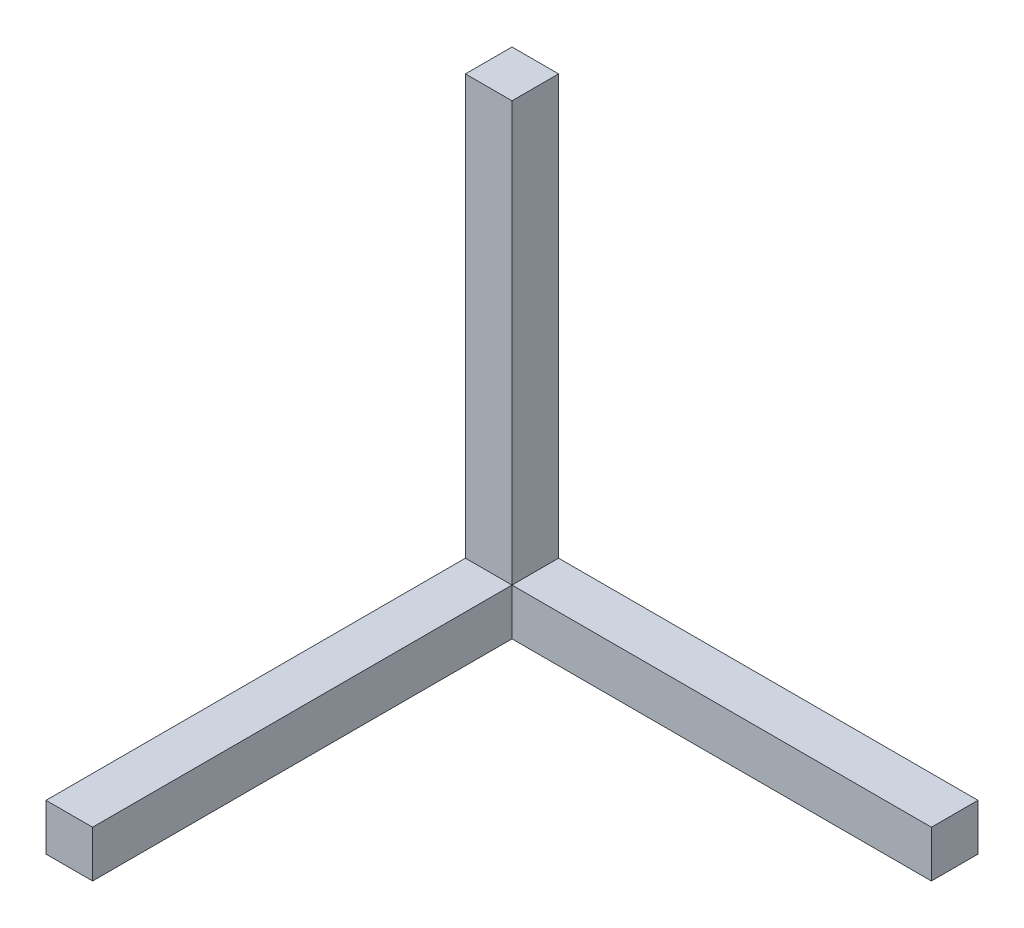
ISO-10303-21;
HEADER;
FILE_DESCRIPTION(('STEP AP214'),'2;1');
FILE_NAME('part.step','',(''),(''),'','','');
FILE_SCHEMA(('AUTOMOTIVE_DESIGN { 1 0 10303 214 1 1 1 1 }'));
ENDSEC;
DATA;
#1=APPLICATION_CONTEXT('core data for automotive mechanical design processes');
#2=APPLICATION_PROTOCOL_DEFINITION('international standard','automotive_design',2000,#1);
#3=PRODUCT_CONTEXT('',#1,'mechanical');
#4=PRODUCT('Part','Part','',(#3));
#5=PRODUCT_RELATED_PRODUCT_CATEGORY('part','',(#4));
#6=PRODUCT_DEFINITION_FORMATION('','',#4);
#7=PRODUCT_DEFINITION_CONTEXT('part definition',#1,'design');
#8=PRODUCT_DEFINITION('design','',#6,#7);
#9=PRODUCT_DEFINITION_SHAPE('','',#8);
#10=(LENGTH_UNIT() NAMED_UNIT(*) SI_UNIT(.MILLI.,.METRE.));
#11=(NAMED_UNIT(*) PLANE_ANGLE_UNIT() SI_UNIT($,.RADIAN.));
#12=(NAMED_UNIT(*) SI_UNIT($,.STERADIAN.) SOLID_ANGLE_UNIT());
#13=UNCERTAINTY_MEASURE_WITH_UNIT(LENGTH_MEASURE(1.E-05),#10,'distance_accuracy_value','');
#14=(GEOMETRIC_REPRESENTATION_CONTEXT(3) GLOBAL_UNCERTAINTY_ASSIGNED_CONTEXT((#13)) GLOBAL_UNIT_ASSIGNED_CONTEXT((#10,
#11,#12)) REPRESENTATION_CONTEXT('',''));
#15=CARTESIAN_POINT('',(0.,0.,0.));
#16=DIRECTION('',(0.,0.,1.));
#17=DIRECTION('',(1.,0.,0.));
#18=AXIS2_PLACEMENT_3D('',#15,#16,#17);
#19=CARTESIAN_POINT('',(-92.7228387327724,0.,10.));
#20=DIRECTION('',(1.,0.,0.));
#21=DIRECTION('',(0.,0.,-1.));
#22=AXIS2_PLACEMENT_3D('',#19,#20,#21);
#23=PLANE('',#22);
#24=DIRECTION('',(0.,-1.,0.));
#25=VECTOR('',#24,1.);
#26=CARTESIAN_POINT('',(-92.7228387327724,0.,10.));
#27=LINE('',#26,#25);
#28=CARTESIAN_POINT('',(-92.7228387327724,57.2847682119205,10.));
#29=VERTEX_POINT('',#28);
#30=CARTESIAN_POINT('',(-92.7228387327724,-32.7152317880795,10.));
#31=VERTEX_POINT('',#30);
#32=EDGE_CURVE('E102',#29,#31,#27,.T.);
#33=ORIENTED_EDGE('',*,*,#32,.T.);
#34=DIRECTION('',(0.,0.,-1.));
#35=VECTOR('',#34,1.);
#36=CARTESIAN_POINT('',(-92.7228387327724,-32.7152317880795,10.));
#37=LINE('',#36,#35);
#38=CARTESIAN_POINT('',(-92.7228387327724,-32.7152317880795,0.));
#39=VERTEX_POINT('',#38);
#40=EDGE_CURVE('E134',#31,#39,#37,.T.);
#41=ORIENTED_EDGE('',*,*,#40,.T.);
#42=DIRECTION('',(0.,-1.,0.));
#43=VECTOR('',#42,1.);
#44=CARTESIAN_POINT('',(-92.7228387327724,0.,0.));
#45=LINE('',#44,#43);
#46=CARTESIAN_POINT('',(-92.7228387327724,57.2847682119205,0.));
#47=VERTEX_POINT('',#46);
#48=EDGE_CURVE('E94',#47,#39,#45,.T.);
#49=ORIENTED_EDGE('',*,*,#48,.F.);
#50=DIRECTION('',(0.,0.,-1.));
#51=VECTOR('',#50,1.);
#52=CARTESIAN_POINT('',(-92.7228387327724,57.2847682119205,10.));
#53=LINE('',#52,#51);
#54=EDGE_CURVE('E11',#29,#47,#53,.T.);
#55=ORIENTED_EDGE('',*,*,#54,.F.);
#56=EDGE_LOOP('',(#33,#41,#49,#55));
#57=FACE_BOUND('',#56,.T.);
#58=ADVANCED_FACE('F37',(#57),#23,.T.);
#59=DIRECTION('',(0.,-1.,0.));
#60=VECTOR('',#59,1.);
#61=CARTESIAN_POINT('',(-92.7228387327724,0.,10.));
#62=LINE('',#61,#60);
#63=CARTESIAN_POINT('',(-92.7228387327724,-42.7152317880795,10.));
#64=VERTEX_POINT('',#63);
#65=EDGE_CURVE('E136',#31,#64,#62,.T.);
#66=ORIENTED_EDGE('',*,*,#65,.F.);
#67=DIRECTION('',(0.,0.,-1.));
#68=VECTOR('',#67,1.);
#69=CARTESIAN_POINT('',(-92.7228387327724,-32.7152317880795,100.));
#70=LINE('',#69,#68);
#71=CARTESIAN_POINT('',(-92.7228387327724,-32.7152317880795,100.));
#72=VERTEX_POINT('',#71);
#73=EDGE_CURVE('E96',#72,#31,#70,.T.);
#74=ORIENTED_EDGE('',*,*,#73,.F.);
#75=DIRECTION('',(0.,-1.,0.));
#76=VECTOR('',#75,1.);
#77=CARTESIAN_POINT('',(-92.7228387327724,0.,100.));
#78=LINE('',#77,#76);
#79=CARTESIAN_POINT('',(-92.7228387327724,-42.7152317880795,100.));
#80=VERTEX_POINT('',#79);
#81=EDGE_CURVE('E118',#72,#80,#78,.T.);
#82=ORIENTED_EDGE('',*,*,#81,.T.);
#83=DIRECTION('',(0.,0.,-1.));
#84=VECTOR('',#83,1.);
#85=CARTESIAN_POINT('',(-92.7228387327724,-42.7152317880795,100.));
#86=LINE('',#85,#84);
#87=EDGE_CURVE('E113',#80,#64,#86,.T.);
#88=ORIENTED_EDGE('',*,*,#87,.T.);
#89=EDGE_LOOP('',(#66,#74,#82,#88));
#90=FACE_BOUND('',#89,.T.);
#91=ADVANCED_FACE('F39',(#90),#23,.T.);
#92=CARTESIAN_POINT('',(0.,57.2847682119204,10.));
#93=DIRECTION('',(0.,1.,0.));
#94=DIRECTION('',(-1.,0.,0.));
#95=AXIS2_PLACEMENT_3D('',#92,#93,#94);
#96=PLANE('',#95);
#97=DIRECTION('',(1.,0.,0.));
#98=VECTOR('',#97,1.);
#99=CARTESIAN_POINT('',(0.,57.2847682119204,0.));
#100=LINE('',#99,#98);
#101=CARTESIAN_POINT('',(-102.722838732772,57.2847682119205,0.));
#102=VERTEX_POINT('',#101);
#103=EDGE_CURVE('E86',#102,#47,#100,.T.);
#104=ORIENTED_EDGE('',*,*,#103,.F.);
#105=DIRECTION('',(0.,0.,-1.));
#106=VECTOR('',#105,1.);
#107=CARTESIAN_POINT('',(-102.722838732772,57.2847682119205,10.));
#108=LINE('',#107,#106);
#109=CARTESIAN_POINT('',(-102.722838732772,57.2847682119205,10.));
#110=VERTEX_POINT('',#109);
#111=EDGE_CURVE('E45',#110,#102,#108,.T.);
#112=ORIENTED_EDGE('',*,*,#111,.F.);
#113=DIRECTION('',(1.,0.,0.));
#114=VECTOR('',#113,1.);
#115=CARTESIAN_POINT('',(0.,57.2847682119204,10.));
#116=LINE('',#115,#114);
#117=EDGE_CURVE('E100',#110,#29,#116,.T.);
#118=ORIENTED_EDGE('',*,*,#117,.T.);
#119=ORIENTED_EDGE('',*,*,#54,.T.);
#120=EDGE_LOOP('',(#104,#112,#118,#119));
#121=FACE_BOUND('',#120,.T.);
#122=ADVANCED_FACE('F92',(#121),#96,.T.);
#123=CARTESIAN_POINT('',(-102.722838732772,0.,10.));
#124=DIRECTION('',(1.,0.,0.));
#125=DIRECTION('',(0.,0.,-1.));
#126=AXIS2_PLACEMENT_3D('',#123,#124,#125);
#127=PLANE('',#126);
#128=DIRECTION('',(0.,-1.,0.));
#129=VECTOR('',#128,1.);
#130=CARTESIAN_POINT('',(-102.722838732772,0.,0.));
#131=LINE('',#130,#129);
#132=CARTESIAN_POINT('',(-102.722838732772,-42.7152317880795,0.));
#133=VERTEX_POINT('',#132);
#134=EDGE_CURVE('E75',#102,#133,#131,.T.);
#135=ORIENTED_EDGE('',*,*,#134,.T.);
#136=DIRECTION('',(0.,0.,-1.));
#137=VECTOR('',#136,1.);
#138=CARTESIAN_POINT('',(-102.722838732772,-42.7152317880795,100.));
#139=LINE('',#138,#137);
#140=CARTESIAN_POINT('',(-102.722838732772,-42.7152317880795,100.));
#141=VERTEX_POINT('',#140);
#142=EDGE_CURVE('E111',#141,#133,#139,.T.);
#143=ORIENTED_EDGE('',*,*,#142,.F.);
#144=DIRECTION('',(0.,-1.,0.));
#145=VECTOR('',#144,1.);
#146=CARTESIAN_POINT('',(-102.722838732772,0.,100.));
#147=LINE('',#146,#145);
#148=CARTESIAN_POINT('',(-102.722838732772,-32.7152317880795,100.));
#149=VERTEX_POINT('',#148);
#150=EDGE_CURVE('E122',#149,#141,#147,.T.);
#151=ORIENTED_EDGE('',*,*,#150,.F.);
#152=DIRECTION('',(0.,0.,-1.));
#153=VECTOR('',#152,1.);
#154=CARTESIAN_POINT('',(-102.722838732772,-32.7152317880795,100.));
#155=LINE('',#154,#153);
#156=CARTESIAN_POINT('',(-102.722838732772,-32.7152317880795,9.99999999999999));
#157=VERTEX_POINT('',#156);
#158=EDGE_CURVE('E109',#149,#157,#155,.T.);
#159=ORIENTED_EDGE('',*,*,#158,.T.);
#160=DIRECTION('',(0.,-1.,0.));
#161=VECTOR('',#160,1.);
#162=CARTESIAN_POINT('',(-102.722838732772,0.,10.));
#163=LINE('',#162,#161);
#164=EDGE_CURVE('E79',#110,#157,#163,.T.);
#165=ORIENTED_EDGE('',*,*,#164,.F.);
#166=ORIENTED_EDGE('',*,*,#111,.T.);
#167=EDGE_LOOP('',(#135,#143,#151,#159,#165,#166));
#168=FACE_BOUND('',#167,.T.);
#169=ADVANCED_FACE('F72',(#168),#127,.F.);
#170=CARTESIAN_POINT('',(0.,0.,10.));
#171=DIRECTION('',(0.,0.,1.));
#172=DIRECTION('',(1.,0.,0.));
#173=AXIS2_PLACEMENT_3D('',#170,#171,#172);
#174=PLANE('',#173);
#175=DIRECTION('',(-1.,0.,0.));
#176=VECTOR('',#175,1.);
#177=CARTESIAN_POINT('',(0.,-32.7152317880795,10.));
#178=LINE('',#177,#176);
#179=EDGE_CURVE('E90',#31,#157,#178,.T.);
#180=ORIENTED_EDGE('',*,*,#179,.F.);
#181=ORIENTED_EDGE('',*,*,#32,.F.);
#182=ORIENTED_EDGE('',*,*,#117,.F.);
#183=ORIENTED_EDGE('',*,*,#164,.T.);
#184=EDGE_LOOP('',(#180,#181,#182,#183));
#185=FACE_BOUND('',#184,.T.);
#186=ADVANCED_FACE('F185',(#185),#174,.T.);
#187=CARTESIAN_POINT('',(0.,0.,0.));
#188=DIRECTION('',(0.,0.,1.));
#189=DIRECTION('',(1.,0.,0.));
#190=AXIS2_PLACEMENT_3D('',#187,#188,#189);
#191=PLANE('',#190);
#192=ORIENTED_EDGE('',*,*,#48,.T.);
#193=DIRECTION('',(-1.,0.,0.));
#194=VECTOR('',#193,1.);
#195=CARTESIAN_POINT('',(0.,-32.7152317880795,0.));
#196=LINE('',#195,#194);
#197=CARTESIAN_POINT('',(-2.72283873277241,-32.7152317880795,0.));
#198=VERTEX_POINT('',#197);
#199=EDGE_CURVE('E52',#198,#39,#196,.T.);
#200=ORIENTED_EDGE('',*,*,#199,.F.);
#201=DIRECTION('',(0.,1.,0.));
#202=VECTOR('',#201,1.);
#203=CARTESIAN_POINT('',(-2.7228387327726,0.,0.));
#204=LINE('',#203,#202);
#205=CARTESIAN_POINT('',(-2.72283873277235,-42.7152317880795,0.));
#206=VERTEX_POINT('',#205);
#207=EDGE_CURVE('E139',#206,#198,#204,.T.);
#208=ORIENTED_EDGE('',*,*,#207,.F.);
#209=DIRECTION('',(1.,0.,0.));
#210=VECTOR('',#209,1.);
#211=CARTESIAN_POINT('',(0.,-42.7152317880795,0.));
#212=LINE('',#211,#210);
#213=EDGE_CURVE('E89',#133,#206,#212,.T.);
#214=ORIENTED_EDGE('',*,*,#213,.F.);
#215=ORIENTED_EDGE('',*,*,#134,.F.);
#216=ORIENTED_EDGE('',*,*,#103,.T.);
#217=EDGE_LOOP('',(#192,#200,#208,#214,#215,#216));
#218=FACE_BOUND('',#217,.T.);
#219=ADVANCED_FACE('F85',(#218),#191,.F.);
#220=CARTESIAN_POINT('',(0.,-32.7152317880795,100.));
#221=DIRECTION('',(0.,-1.,0.));
#222=DIRECTION('',(0.,0.,-1.));
#223=AXIS2_PLACEMENT_3D('',#220,#221,#222);
#224=PLANE('',#223);
#225=ORIENTED_EDGE('',*,*,#73,.T.);
#226=ORIENTED_EDGE('',*,*,#179,.T.);
#227=ORIENTED_EDGE('',*,*,#158,.F.);
#228=DIRECTION('',(-1.,0.,0.));
#229=VECTOR('',#228,1.);
#230=CARTESIAN_POINT('',(0.,-32.7152317880795,100.));
#231=LINE('',#230,#229);
#232=EDGE_CURVE('E125',#72,#149,#231,.T.);
#233=ORIENTED_EDGE('',*,*,#232,.F.);
#234=EDGE_LOOP('',(#225,#226,#227,#233));
#235=FACE_BOUND('',#234,.T.);
#236=ADVANCED_FACE('F190',(#235),#224,.F.);
#237=CARTESIAN_POINT('',(0.,-42.7152317880795,100.));
#238=DIRECTION('',(0.,1.,0.));
#239=DIRECTION('',(0.,0.,1.));
#240=AXIS2_PLACEMENT_3D('',#237,#238,#239);
#241=PLANE('',#240);
#242=ORIENTED_EDGE('',*,*,#213,.T.);
#243=DIRECTION('',(0.,0.,-1.));
#244=VECTOR('',#243,1.);
#245=CARTESIAN_POINT('',(-2.72283873277235,-42.7152317880795,10.));
#246=LINE('',#245,#244);
#247=CARTESIAN_POINT('',(-2.72283873277235,-42.7152317880795,10.));
#248=VERTEX_POINT('',#247);
#249=EDGE_CURVE('E119',#248,#206,#246,.T.);
#250=ORIENTED_EDGE('',*,*,#249,.F.);
#251=DIRECTION('',(1.,0.,0.));
#252=VECTOR('',#251,1.);
#253=CARTESIAN_POINT('',(0.,-42.7152317880795,10.));
#254=LINE('',#253,#252);
#255=EDGE_CURVE('E138',#64,#248,#254,.T.);
#256=ORIENTED_EDGE('',*,*,#255,.F.);
#257=ORIENTED_EDGE('',*,*,#87,.F.);
#258=DIRECTION('',(1.,0.,0.));
#259=VECTOR('',#258,1.);
#260=CARTESIAN_POINT('',(0.,-42.7152317880795,100.));
#261=LINE('',#260,#259);
#262=EDGE_CURVE('E116',#141,#80,#261,.T.);
#263=ORIENTED_EDGE('',*,*,#262,.F.);
#264=ORIENTED_EDGE('',*,*,#142,.T.);
#265=EDGE_LOOP('',(#242,#250,#256,#257,#263,#264));
#266=FACE_BOUND('',#265,.T.);
#267=ADVANCED_FACE('F165',(#266),#241,.F.);
#268=CARTESIAN_POINT('',(0.,0.,100.));
#269=DIRECTION('',(0.,0.,1.));
#270=DIRECTION('',(1.,0.,0.));
#271=AXIS2_PLACEMENT_3D('',#268,#269,#270);
#272=PLANE('',#271);
#273=ORIENTED_EDGE('',*,*,#81,.F.);
#274=ORIENTED_EDGE('',*,*,#232,.T.);
#275=ORIENTED_EDGE('',*,*,#150,.T.);
#276=ORIENTED_EDGE('',*,*,#262,.T.);
#277=EDGE_LOOP('',(#273,#274,#275,#276));
#278=FACE_BOUND('',#277,.T.);
#279=ADVANCED_FACE('F196',(#278),#272,.T.);
#280=CARTESIAN_POINT('',(-2.7228387327726,0.,10.));
#281=DIRECTION('',(-1.,0.,0.));
#282=DIRECTION('',(0.,-1.,0.));
#283=AXIS2_PLACEMENT_3D('',#280,#281,#282);
#284=PLANE('',#283);
#285=ORIENTED_EDGE('',*,*,#207,.T.);
#286=DIRECTION('',(0.,0.,-1.));
#287=VECTOR('',#286,1.);
#288=CARTESIAN_POINT('',(-2.72283873277241,-32.7152317880795,10.));
#289=LINE('',#288,#287);
#290=CARTESIAN_POINT('',(-2.72283873277241,-32.7152317880795,10.));
#291=VERTEX_POINT('',#290);
#292=EDGE_CURVE('E132',#291,#198,#289,.T.);
#293=ORIENTED_EDGE('',*,*,#292,.F.);
#294=DIRECTION('',(0.,1.,0.));
#295=VECTOR('',#294,1.);
#296=CARTESIAN_POINT('',(-2.7228387327726,0.,10.));
#297=LINE('',#296,#295);
#298=EDGE_CURVE('E147',#248,#291,#297,.T.);
#299=ORIENTED_EDGE('',*,*,#298,.F.);
#300=ORIENTED_EDGE('',*,*,#249,.T.);
#301=EDGE_LOOP('',(#285,#293,#299,#300));
#302=FACE_BOUND('',#301,.T.);
#303=ADVANCED_FACE('F168',(#302),#284,.F.);
#304=CARTESIAN_POINT('',(0.,-32.7152317880795,10.));
#305=DIRECTION('',(0.,-1.,0.));
#306=DIRECTION('',(1.,0.,0.));
#307=AXIS2_PLACEMENT_3D('',#304,#305,#306);
#308=PLANE('',#307);
#309=ORIENTED_EDGE('',*,*,#199,.T.);
#310=ORIENTED_EDGE('',*,*,#40,.F.);
#311=DIRECTION('',(-1.,0.,0.));
#312=VECTOR('',#311,1.);
#313=CARTESIAN_POINT('',(0.,-32.7152317880795,10.));
#314=LINE('',#313,#312);
#315=EDGE_CURVE('E144',#291,#31,#314,.T.);
#316=ORIENTED_EDGE('',*,*,#315,.F.);
#317=ORIENTED_EDGE('',*,*,#292,.T.);
#318=EDGE_LOOP('',(#309,#310,#316,#317));
#319=FACE_BOUND('',#318,.T.);
#320=ADVANCED_FACE('F200',(#319),#308,.F.);
#321=CARTESIAN_POINT('',(0.,0.,10.));
#322=DIRECTION('',(0.,0.,1.));
#323=DIRECTION('',(1.,0.,0.));
#324=AXIS2_PLACEMENT_3D('',#321,#322,#323);
#325=PLANE('',#324);
#326=ORIENTED_EDGE('',*,*,#255,.T.);
#327=ORIENTED_EDGE('',*,*,#298,.T.);
#328=ORIENTED_EDGE('',*,*,#315,.T.);
#329=ORIENTED_EDGE('',*,*,#65,.T.);
#330=EDGE_LOOP('',(#326,#327,#328,#329));
#331=FACE_BOUND('',#330,.T.);
#332=ADVANCED_FACE('F155',(#331),#325,.T.);
#333=CLOSED_SHELL('',(#58,#91,#122,#169,#186,#219,#236,#267,#279,#303,#320,#332));
#334=MANIFOLD_SOLID_BREP('B2',#333);
#335=ADVANCED_BREP_SHAPE_REPRESENTATION('',(#18,#334),#14);
#336=SHAPE_DEFINITION_REPRESENTATION(#9,#335);
ENDSEC;
END-ISO-10303-21;
